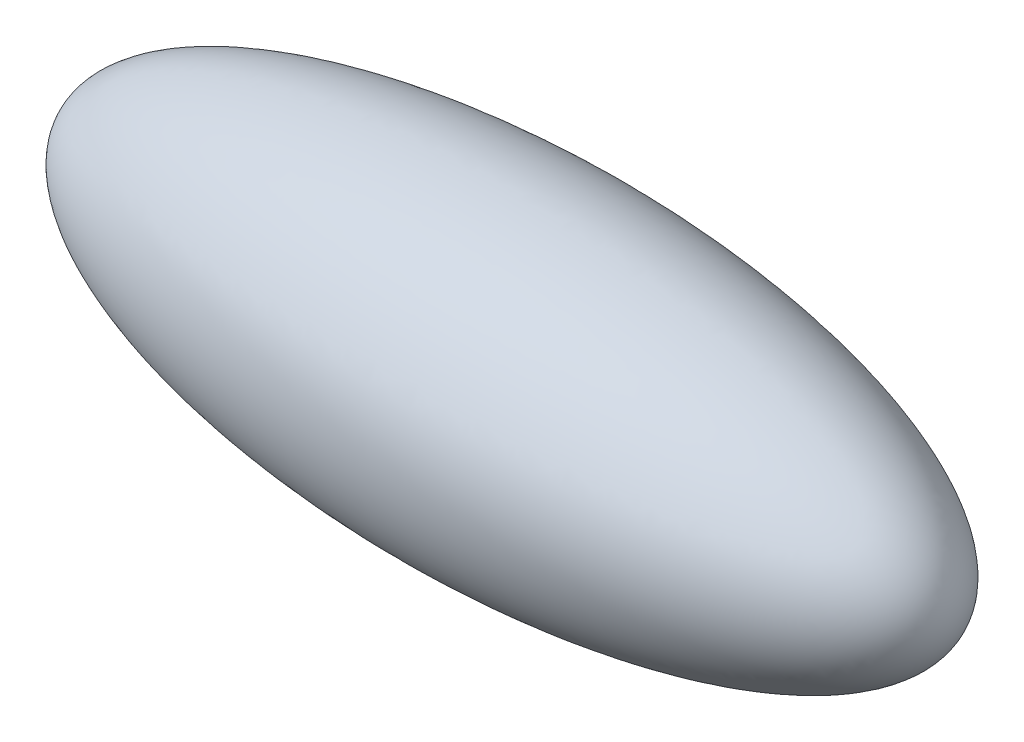
ISO-10303-21;
HEADER;
FILE_DESCRIPTION(('STEP AP214'),'2;1');
FILE_NAME('part.step','',(''),(''),'','','');
FILE_SCHEMA(('AUTOMOTIVE_DESIGN { 1 0 10303 214 1 1 1 1 }'));
ENDSEC;
DATA;
#1=APPLICATION_CONTEXT('core data for automotive mechanical design processes');
#2=APPLICATION_PROTOCOL_DEFINITION('international standard','automotive_design',2000,#1);
#3=PRODUCT_CONTEXT('',#1,'mechanical');
#4=PRODUCT('Part','Part','',(#3));
#5=PRODUCT_RELATED_PRODUCT_CATEGORY('part','',(#4));
#6=PRODUCT_DEFINITION_FORMATION('','',#4);
#7=PRODUCT_DEFINITION_CONTEXT('part definition',#1,'design');
#8=PRODUCT_DEFINITION('design','',#6,#7);
#9=PRODUCT_DEFINITION_SHAPE('','',#8);
#10=(LENGTH_UNIT() NAMED_UNIT(*) SI_UNIT(.MILLI.,.METRE.));
#11=(NAMED_UNIT(*) PLANE_ANGLE_UNIT() SI_UNIT($,.RADIAN.));
#12=(NAMED_UNIT(*) SI_UNIT($,.STERADIAN.) SOLID_ANGLE_UNIT());
#13=UNCERTAINTY_MEASURE_WITH_UNIT(LENGTH_MEASURE(1.E-05),#10,'distance_accuracy_value','');
#14=(GEOMETRIC_REPRESENTATION_CONTEXT(3) GLOBAL_UNCERTAINTY_ASSIGNED_CONTEXT((#13)) GLOBAL_UNIT_ASSIGNED_CONTEXT((#10,
#11,#12)) REPRESENTATION_CONTEXT('',''));
#15=CARTESIAN_POINT('',(0.,0.,0.));
#16=DIRECTION('',(0.,0.,1.));
#17=DIRECTION('',(1.,0.,0.));
#18=AXIS2_PLACEMENT_3D('',#15,#16,#17);
#19=CARTESIAN_POINT('',(310.,0.,0.));
#20=CARTESIAN_POINT('',(310.,0.,-2.12712002586809));
#21=CARTESIAN_POINT('',(309.842849563289,0.,-4.25409647331257));
#22=CARTESIAN_POINT('',(309.22068956277,0.,-8.4755490560204));
#23=CARTESIAN_POINT('',(308.755852364689,0.,-10.5698267259364));
#24=CARTESIAN_POINT('',(307.535235306145,0.,-14.7008710504073));
#25=CARTESIAN_POINT('',(306.779668359957,0.,-16.7376168855933));
#26=CARTESIAN_POINT('',(304.998645063423,0.,-20.7398448144331));
#27=CARTESIAN_POINT('',(303.973325365894,0.,-22.7054292060408));
#28=CARTESIAN_POINT('',(300.521899614573,0.,-28.4892588672928));
#29=CARTESIAN_POINT('',(297.722567478682,0.,-32.1937433994712));
#30=CARTESIAN_POINT('',(291.23344543308,0.,-39.3243329155481));
#31=CARTESIAN_POINT('',(287.542484762937,0.,-42.7521697493101));
#32=CARTESIAN_POINT('',(279.324097170274,0.,-49.3658173449922));
#33=CARTESIAN_POINT('',(274.795788606965,0.,-52.5518000758822));
#34=CARTESIAN_POINT('',(264.940137015337,0.,-58.6980091560084));
#35=CARTESIAN_POINT('',(259.612439731343,0.,-61.6580381458592));
#36=CARTESIAN_POINT('',(248.197397111783,0.,-67.3526443343612));
#37=CARTESIAN_POINT('',(242.109953941991,0.,-70.0870355311138));
#38=CARTESIAN_POINT('',(229.222552276797,0.,-75.3214836526829));
#39=CARTESIAN_POINT('',(222.422590136989,0.,-77.8214183922078));
#40=CARTESIAN_POINT('',(201.03775577442,0.,-84.949696513064));
#41=CARTESIAN_POINT('',(185.464393574888,0.,-89.2062282024637));
#42=CARTESIAN_POINT('',(152.22573062133,0.,-96.6093497153195));
#43=CARTESIAN_POINT('',(134.561557300352,0.,-99.7550142912707));
#44=CARTESIAN_POINT('',(97.7839749121647,0.,-104.832938763431));
#45=CARTESIAN_POINT('',(78.671669858425,0.,-106.764816866028));
#46=CARTESIAN_POINT('',(39.7057004901363,0.,-109.348421270791));
#47=CARTESIAN_POINT('',(19.8531202414355,0.,-110.));
#48=CARTESIAN_POINT('',(-19.8531202414355,0.,-110.));
#49=CARTESIAN_POINT('',(-39.7057004901362,0.,-109.348421270791));
#50=CARTESIAN_POINT('',(-78.671669858425,0.,-106.764816866028));
#51=CARTESIAN_POINT('',(-97.7839749121647,0.,-104.832938763431));
#52=CARTESIAN_POINT('',(-134.561557300352,0.,-99.7550142912707));
#53=CARTESIAN_POINT('',(-152.22573062133,0.,-96.6093497153195));
#54=CARTESIAN_POINT('',(-185.464393574888,0.,-89.2062282024637));
#55=CARTESIAN_POINT('',(-201.03775577442,0.,-84.949696513064));
#56=CARTESIAN_POINT('',(-222.422590136989,0.,-77.8214183922079));
#57=CARTESIAN_POINT('',(-229.222552276797,0.,-75.3214836526829));
#58=CARTESIAN_POINT('',(-242.109953941991,0.,-70.0870355311138));
#59=CARTESIAN_POINT('',(-248.197397111783,0.,-67.3526443343612));
#60=CARTESIAN_POINT('',(-259.612439731343,0.,-61.6580381458592));
#61=CARTESIAN_POINT('',(-264.940137015337,0.,-58.6980091560084));
#62=CARTESIAN_POINT('',(-274.795788606965,0.,-52.5518000758822));
#63=CARTESIAN_POINT('',(-279.324097170274,0.,-49.3658173449922));
#64=CARTESIAN_POINT('',(-287.542484762937,0.,-42.7521697493101));
#65=CARTESIAN_POINT('',(-291.233445433081,0.,-39.3243329155481));
#66=CARTESIAN_POINT('',(-297.722567478682,0.,-32.1937433994712));
#67=CARTESIAN_POINT('',(-300.521899614573,0.,-28.4892588672928));
#68=CARTESIAN_POINT('',(-303.973325365894,0.,-22.7054292060409));
#69=CARTESIAN_POINT('',(-304.998645063423,0.,-20.7398448144332));
#70=CARTESIAN_POINT('',(-306.779668359957,0.,-16.7376168855933));
#71=CARTESIAN_POINT('',(-307.535235306145,0.,-14.7008710504073));
#72=CARTESIAN_POINT('',(-308.755852364689,0.,-10.5698267259364));
#73=CARTESIAN_POINT('',(-309.22068956277,0.,-8.47554905602046));
#74=CARTESIAN_POINT('',(-309.842849563289,0.,-4.25409647331262));
#75=CARTESIAN_POINT('',(-310.,0.,-2.12712002586811));
#76=CARTESIAN_POINT('',(-310.,0.,0.));
#77=B_SPLINE_CURVE_WITH_KNOTS('',3,(#19,#20,#21,#22,#23,#24,#25,#26,#27,#28,#29,#30,#31,#32,#33,
#34,#35,#36,#37,#38,#39,#40,#41,#42,#43,#44,#45,#46,#47,#48,#49,#50,#51,#52,#53,#54,#55,#56,#57,
#58,#59,#60,#61,#62,#63,#64,#65,#66,#67,#68,#69,#70,#71,#72,#73,#74,#75,#76),.UNSPECIFIED.,.F.,
.F.,(4,2,2,2,2,2,2,2,2,2,2,2,2,2,2,2,2,2,2,2,2,2,2,2,2,2,2,2,4),(0.,0.015625,0.0312499999999999,
0.0468749999999998,0.0624999999999998,0.0937499999999997,0.125,0.156249999999999,
0.187499999999999,0.218749999999999,0.25,0.3125,0.375,0.4375,0.5,0.562500000000001,
0.625000000000001,0.687500000000001,0.750000000000001,0.781250000000001,0.812500000000001,
0.843750000000001,0.875000000000001,0.90625,0.9375,0.953125,0.96875,0.984375,1.),.UNSPECIFIED.);
#78=CARTESIAN_POINT('',(-300.,0.,0.));
#79=DIRECTION('',(-1.,0.,0.));
#80=AXIS1_PLACEMENT('',#78,#79);
#81=SURFACE_OF_REVOLUTION('',#77,#80);
#82=CARTESIAN_POINT('',(-310.,0.,0.));
#83=VERTEX_POINT('',#82);
#84=VERTEX_LOOP('',#83);
#85=FACE_BOUND('',#84,.T.);
#86=CARTESIAN_POINT('',(310.,0.,0.));
#87=VERTEX_POINT('',#86);
#88=VERTEX_LOOP('',#87);
#89=FACE_BOUND('',#88,.T.);
#90=ADVANCED_FACE('F33',(#85,#89),#81,.T.);
#91=CLOSED_SHELL('',(#90));
#92=CARTESIAN_POINT('',(0.,0.,0.));
#93=DIRECTION('',(0.,1.,0.));
#94=DIRECTION('',(1.,0.,0.));
#95=AXIS2_PLACEMENT_3D('',#92,#93,#94);
#96=ELLIPSE('',#95,300.,100.);
#97=TRIMMED_CURVE('',#96,(PARAMETER_VALUE(0.)),(PARAMETER_VALUE(3.14159265358979)),.T.,.PARAMETER.);
#98=CARTESIAN_POINT('',(-300.,0.,0.));
#99=DIRECTION('',(-1.,0.,0.));
#100=AXIS1_PLACEMENT('',#98,#99);
#101=SURFACE_OF_REVOLUTION('',#97,#100);
#102=CARTESIAN_POINT('',(-300.,0.,0.));
#103=VERTEX_POINT('',#102);
#104=VERTEX_LOOP('',#103);
#105=FACE_BOUND('',#104,.T.);
#106=CARTESIAN_POINT('',(300.,0.,0.));
#107=VERTEX_POINT('',#106);
#108=VERTEX_LOOP('',#107);
#109=FACE_BOUND('',#108,.T.);
#110=ADVANCED_FACE('F60',(#105,#109),#101,.F.);
#111=CLOSED_SHELL('',(#110));
#112=ORIENTED_CLOSED_SHELL('',*,#111,.T.);
#113=BREP_WITH_VOIDS('B2',#91,(#112));
#114=ADVANCED_BREP_SHAPE_REPRESENTATION('',(#18,#113),#14);
#115=SHAPE_DEFINITION_REPRESENTATION(#9,#114);
ENDSEC;
END-ISO-10303-21;
